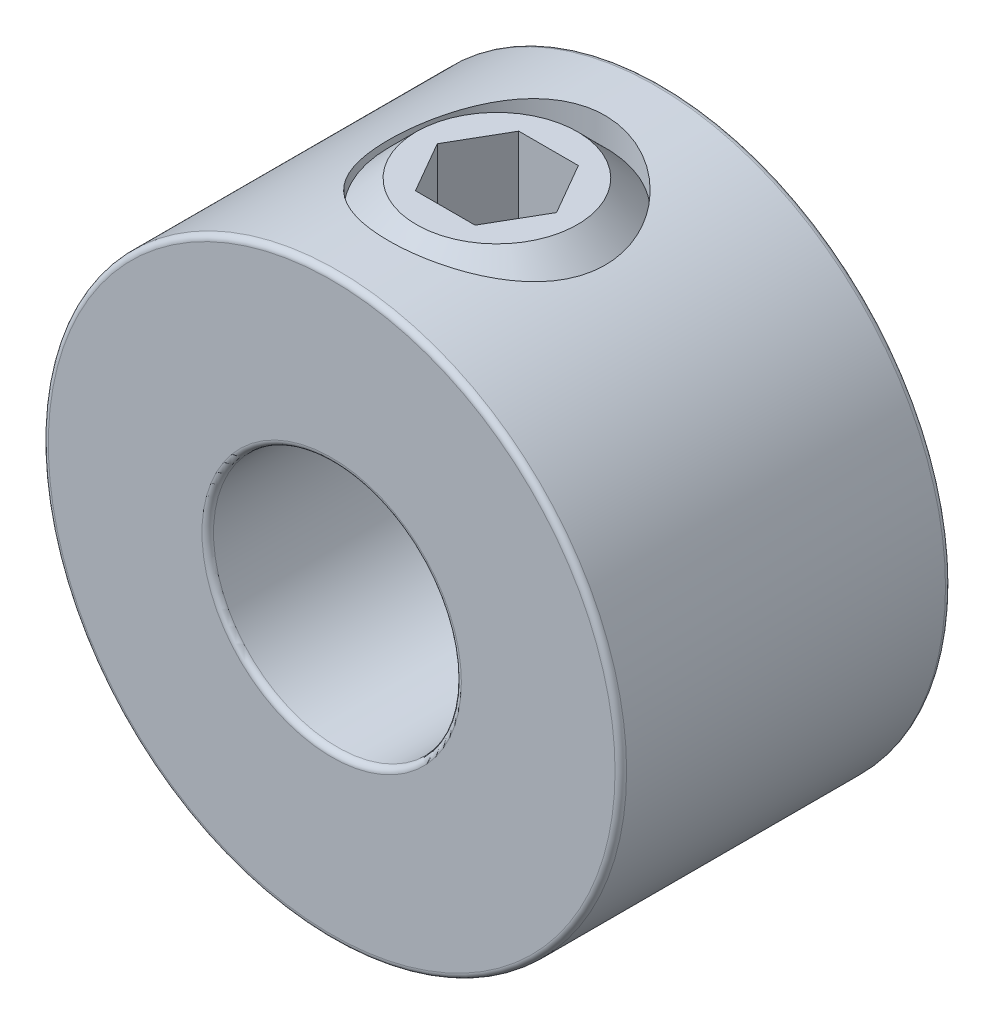
ISO-10303-21;
HEADER;
FILE_DESCRIPTION(('STEP AP214'),'2;1');
FILE_NAME('part.step','',(''),(''),'','','');
FILE_SCHEMA(('AUTOMOTIVE_DESIGN { 1 0 10303 214 1 1 1 1 }'));
ENDSEC;
DATA;
#1=APPLICATION_CONTEXT('core data for automotive mechanical design processes');
#2=APPLICATION_PROTOCOL_DEFINITION('international standard','automotive_design',2000,#1);
#3=PRODUCT_CONTEXT('',#1,'mechanical');
#4=PRODUCT('Part','Part','',(#3));
#5=PRODUCT_RELATED_PRODUCT_CATEGORY('part','',(#4));
#6=PRODUCT_DEFINITION_FORMATION('','',#4);
#7=PRODUCT_DEFINITION_CONTEXT('part definition',#1,'design');
#8=PRODUCT_DEFINITION('design','',#6,#7);
#9=PRODUCT_DEFINITION_SHAPE('','',#8);
#10=(LENGTH_UNIT() NAMED_UNIT(*) SI_UNIT(.MILLI.,.METRE.));
#11=(NAMED_UNIT(*) PLANE_ANGLE_UNIT() SI_UNIT($,.RADIAN.));
#12=(NAMED_UNIT(*) SI_UNIT($,.STERADIAN.) SOLID_ANGLE_UNIT());
#13=UNCERTAINTY_MEASURE_WITH_UNIT(LENGTH_MEASURE(1.E-05),#10,'distance_accuracy_value','');
#14=(GEOMETRIC_REPRESENTATION_CONTEXT(3) GLOBAL_UNCERTAINTY_ASSIGNED_CONTEXT((#13)) GLOBAL_UNIT_ASSIGNED_CONTEXT((#10,
#11,#12)) REPRESENTATION_CONTEXT('',''));
#15=CARTESIAN_POINT('',(0.,0.,0.));
#16=DIRECTION('',(0.,0.,1.));
#17=DIRECTION('',(1.,0.,0.));
#18=AXIS2_PLACEMENT_3D('',#15,#16,#17);
#19=CARTESIAN_POINT('',(0.,5.55625,0.));
#20=DIRECTION('',(0.,1.,0.));
#21=DIRECTION('',(-1.,0.,0.));
#22=AXIS2_PLACEMENT_3D('',#19,#20,#21);
#23=PLANE('',#22);
#24=CARTESIAN_POINT('',(0.,5.55625,0.));
#25=DIRECTION('',(0.,1.,0.));
#26=DIRECTION('',(-1.,0.,0.));
#27=AXIS2_PLACEMENT_3D('',#24,#25,#26);
#28=CIRCLE('',#27,1.54730253738467);
#29=CARTESIAN_POINT('',(-1.54730253738467,5.55625,0.));
#30=VERTEX_POINT('',#29);
#31=EDGE_CURVE('E116',#30,#30,#28,.T.);
#32=ORIENTED_EDGE('',*,*,#31,.T.);
#33=EDGE_LOOP('',(#32));
#34=FACE_BOUND('',#33,.T.);
#35=DIRECTION('',(1.,0.,0.));
#36=VECTOR('',#35,1.);
#37=CARTESIAN_POINT('',(-0.572839720211581,5.55624999999999,-0.992187499999997));
#38=LINE('',#37,#36);
#39=CARTESIAN_POINT('',(-0.572839720211581,5.55624999999999,-0.992187499999997));
#40=VERTEX_POINT('',#39);
#41=CARTESIAN_POINT('',(0.572839720211583,5.55625,-0.992187499999997));
#42=VERTEX_POINT('',#41);
#43=EDGE_CURVE('E111',#40,#42,#38,.T.);
#44=ORIENTED_EDGE('',*,*,#43,.T.);
#45=DIRECTION('',(0.5,0.,0.866025403784439));
#46=VECTOR('',#45,1.);
#47=CARTESIAN_POINT('',(0.572839720211583,5.55624999999999,-0.992187499999997));
#48=LINE('',#47,#46);
#49=CARTESIAN_POINT('',(1.14567944042317,5.55624999999999,0.));
#50=VERTEX_POINT('',#49);
#51=EDGE_CURVE('E57',#42,#50,#48,.T.);
#52=ORIENTED_EDGE('',*,*,#51,.T.);
#53=DIRECTION('',(-0.499999999999999,0.,0.866025403784439));
#54=VECTOR('',#53,1.);
#55=CARTESIAN_POINT('',(1.14567944042317,5.55624999999999,0.));
#56=LINE('',#55,#54);
#57=CARTESIAN_POINT('',(0.572839720211584,5.55624999999999,0.992187500000003));
#58=VERTEX_POINT('',#57);
#59=EDGE_CURVE('E115',#50,#58,#56,.T.);
#60=ORIENTED_EDGE('',*,*,#59,.T.);
#61=DIRECTION('',(-1.,0.,0.));
#62=VECTOR('',#61,1.);
#63=CARTESIAN_POINT('',(0.572839720211584,5.55624999999999,0.992187500000003));
#64=LINE('',#63,#62);
#65=CARTESIAN_POINT('',(-0.572839720211581,5.55624999999999,0.992187500000003));
#66=VERTEX_POINT('',#65);
#67=EDGE_CURVE('E273',#58,#66,#64,.T.);
#68=ORIENTED_EDGE('',*,*,#67,.T.);
#69=DIRECTION('',(-0.5,0.,-0.866025403784439));
#70=VECTOR('',#69,1.);
#71=CARTESIAN_POINT('',(-0.572839720211581,5.55624999999999,0.992187500000003));
#72=LINE('',#71,#70);
#73=CARTESIAN_POINT('',(-1.14567944042316,5.55624999999999,0.));
#74=VERTEX_POINT('',#73);
#75=EDGE_CURVE('E270',#66,#74,#72,.T.);
#76=ORIENTED_EDGE('',*,*,#75,.T.);
#77=DIRECTION('',(0.5,0.,-0.866025403784439));
#78=VECTOR('',#77,1.);
#79=CARTESIAN_POINT('',(-1.14567944042316,5.55624999999999,0.));
#80=LINE('',#79,#78);
#81=EDGE_CURVE('E264',#74,#40,#80,.T.);
#82=ORIENTED_EDGE('',*,*,#81,.T.);
#83=EDGE_LOOP('',(#44,#52,#60,#68,#76,#82));
#84=FACE_BOUND('',#83,.T.);
#85=ADVANCED_FACE('F42',(#34,#84),#23,.T.);
#86=CARTESIAN_POINT('',(0.,2.38125,0.));
#87=DIRECTION('',(0.,-1.,0.));
#88=DIRECTION('',(1.,0.,0.));
#89=AXIS2_PLACEMENT_3D('',#86,#87,#88);
#90=CONICAL_SURFACE('',#89,0.642596955138401,0.785398163397449);
#91=CARTESIAN_POINT('',(0.,3.0238469551384,0.));
#92=VERTEX_POINT('',#91);
#93=VERTEX_LOOP('',#92);
#94=FACE_BOUND('',#93,.T.);
#95=CARTESIAN_POINT('',(0.,2.38125,0.));
#96=DIRECTION('',(0.,1.,0.));
#97=DIRECTION('',(-1.,0.,0.));
#98=AXIS2_PLACEMENT_3D('',#95,#96,#97);
#99=CIRCLE('',#98,0.642596955138401);
#100=CARTESIAN_POINT('',(-0.642596955138401,2.38125,0.));
#101=VERTEX_POINT('',#100);
#102=EDGE_CURVE('E12',#101,#101,#99,.T.);
#103=ORIENTED_EDGE('',*,*,#102,.F.);
#104=EDGE_LOOP('',(#103));
#105=FACE_BOUND('',#104,.T.);
#106=ADVANCED_FACE('F44',(#94,#105),#90,.F.);
#107=CARTESIAN_POINT('',(-1.54730253738467,2.38125,0.));
#108=DIRECTION('',(0.,-1.,0.));
#109=DIRECTION('',(1.,0.,0.));
#110=AXIS2_PLACEMENT_3D('',#107,#108,#109);
#111=PLANE('',#110);
#112=ORIENTED_EDGE('',*,*,#102,.T.);
#113=EDGE_LOOP('',(#112));
#114=FACE_BOUND('',#113,.T.);
#115=CARTESIAN_POINT('',(0.,2.38125,0.));
#116=DIRECTION('',(0.,1.,0.));
#117=DIRECTION('',(-1.,0.,0.));
#118=AXIS2_PLACEMENT_3D('',#115,#116,#117);
#119=CIRCLE('',#118,1.54730253738467);
#120=CARTESIAN_POINT('',(-1.54730253738467,2.38125,0.));
#121=VERTEX_POINT('',#120);
#122=EDGE_CURVE('E50',#121,#121,#119,.T.);
#123=ORIENTED_EDGE('',*,*,#122,.F.);
#124=EDGE_LOOP('',(#123));
#125=FACE_BOUND('',#124,.T.);
#126=ADVANCED_FACE('F136',(#114,#125),#111,.T.);
#127=CARTESIAN_POINT('',(0.,2.91674746261533,0.));
#128=DIRECTION('',(0.,1.,0.));
#129=DIRECTION('',(-1.,0.,0.));
#130=AXIS2_PLACEMENT_3D('',#127,#128,#129);
#131=CONICAL_SURFACE('',#130,2.0828,0.785398163397448);
#132=ORIENTED_EDGE('',*,*,#122,.T.);
#133=EDGE_LOOP('',(#132));
#134=FACE_BOUND('',#133,.T.);
#135=CARTESIAN_POINT('',(0.,2.91674746261533,0.));
#136=DIRECTION('',(0.,1.,0.));
#137=DIRECTION('',(-1.,0.,0.));
#138=AXIS2_PLACEMENT_3D('',#135,#136,#137);
#139=CIRCLE('',#138,2.0828);
#140=CARTESIAN_POINT('',(-2.0828,2.91674746261533,0.));
#141=VERTEX_POINT('',#140);
#142=EDGE_CURVE('E128',#141,#141,#139,.T.);
#143=ORIENTED_EDGE('',*,*,#142,.F.);
#144=EDGE_LOOP('',(#143));
#145=FACE_BOUND('',#144,.T.);
#146=ADVANCED_FACE('F133',(#134,#145),#131,.T.);
#147=CARTESIAN_POINT('',(0.,2.38125,0.));
#148=DIRECTION('',(0.,1.,0.));
#149=DIRECTION('',(-1.,0.,0.));
#150=AXIS2_PLACEMENT_3D('',#147,#148,#149);
#151=CYLINDRICAL_SURFACE('',#150,2.0828);
#152=ORIENTED_EDGE('',*,*,#142,.T.);
#153=EDGE_LOOP('',(#152));
#154=FACE_BOUND('',#153,.T.);
#155=CARTESIAN_POINT('',(0.,5.02075253738467,0.));
#156=DIRECTION('',(0.,1.,0.));
#157=DIRECTION('',(-1.,0.,0.));
#158=AXIS2_PLACEMENT_3D('',#155,#156,#157);
#159=CIRCLE('',#158,2.0828);
#160=CARTESIAN_POINT('',(-2.0828,5.02075253738467,0.));
#161=VERTEX_POINT('',#160);
#162=EDGE_CURVE('E120',#161,#161,#159,.T.);
#163=ORIENTED_EDGE('',*,*,#162,.F.);
#164=EDGE_LOOP('',(#163));
#165=FACE_BOUND('',#164,.T.);
#166=ADVANCED_FACE('F143',(#154,#165),#151,.T.);
#167=CARTESIAN_POINT('',(0.,5.55625,0.));
#168=DIRECTION('',(0.,-1.,0.));
#169=DIRECTION('',(1.,0.,0.));
#170=AXIS2_PLACEMENT_3D('',#167,#168,#169);
#171=CONICAL_SURFACE('',#170,1.54730253738467,0.785398163397448);
#172=ORIENTED_EDGE('',*,*,#162,.T.);
#173=EDGE_LOOP('',(#172));
#174=FACE_BOUND('',#173,.T.);
#175=ORIENTED_EDGE('',*,*,#31,.F.);
#176=EDGE_LOOP('',(#175));
#177=FACE_BOUND('',#176,.T.);
#178=ADVANCED_FACE('F154',(#174,#177),#171,.T.);
#179=CARTESIAN_POINT('',(0.572839720211583,3.57187499999999,-0.992187499999997));
#180=DIRECTION('',(-0.866025403784439,0.,0.5));
#181=DIRECTION('',(0.5,0.,0.866025403784439));
#182=AXIS2_PLACEMENT_3D('',#179,#180,#181);
#183=PLANE('',#182);
#184=ORIENTED_EDGE('',*,*,#51,.F.);
#185=DIRECTION('',(0.,1.,0.));
#186=VECTOR('',#185,1.);
#187=CARTESIAN_POINT('',(0.572839720211583,3.57187499999999,-0.992187499999997));
#188=LINE('',#187,#186);
#189=CARTESIAN_POINT('',(0.572839720211583,3.57187499999999,-0.992187499999997));
#190=VERTEX_POINT('',#189);
#191=EDGE_CURVE('E110',#190,#42,#188,.T.);
#192=ORIENTED_EDGE('',*,*,#191,.F.);
#193=DIRECTION('',(0.5,0.,0.866025403784439));
#194=VECTOR('',#193,1.);
#195=CARTESIAN_POINT('',(0.572839720211583,3.57187499999999,-0.992187499999997));
#196=LINE('',#195,#194);
#197=CARTESIAN_POINT('',(1.14567944042317,3.57187499999999,0.));
#198=VERTEX_POINT('',#197);
#199=EDGE_CURVE('E101',#190,#198,#196,.T.);
#200=ORIENTED_EDGE('',*,*,#199,.T.);
#201=DIRECTION('',(0.,1.,0.));
#202=VECTOR('',#201,1.);
#203=CARTESIAN_POINT('',(1.14567944042317,3.57187499999999,0.));
#204=LINE('',#203,#202);
#205=EDGE_CURVE('E109',#198,#50,#204,.T.);
#206=ORIENTED_EDGE('',*,*,#205,.T.);
#207=EDGE_LOOP('',(#184,#192,#200,#206));
#208=FACE_BOUND('',#207,.T.);
#209=ADVANCED_FACE('F108',(#208),#183,.T.);
#210=CARTESIAN_POINT('',(1.14567944042317,3.57187499999999,0.));
#211=DIRECTION('',(-0.866025403784439,0.,-0.499999999999999));
#212=DIRECTION('',(-0.499999999999999,0.,0.866025403784439));
#213=AXIS2_PLACEMENT_3D('',#210,#211,#212);
#214=PLANE('',#213);
#215=ORIENTED_EDGE('',*,*,#59,.F.);
#216=ORIENTED_EDGE('',*,*,#205,.F.);
#217=DIRECTION('',(-0.499999999999999,0.,0.866025403784439));
#218=VECTOR('',#217,1.);
#219=CARTESIAN_POINT('',(1.14567944042317,3.57187499999999,0.));
#220=LINE('',#219,#218);
#221=CARTESIAN_POINT('',(0.572839720211584,3.57187499999999,0.992187500000003));
#222=VERTEX_POINT('',#221);
#223=EDGE_CURVE('E97',#198,#222,#220,.T.);
#224=ORIENTED_EDGE('',*,*,#223,.T.);
#225=DIRECTION('',(0.,1.,0.));
#226=VECTOR('',#225,1.);
#227=CARTESIAN_POINT('',(0.572839720211584,3.57187499999999,0.992187500000003));
#228=LINE('',#227,#226);
#229=EDGE_CURVE('E117',#222,#58,#228,.T.);
#230=ORIENTED_EDGE('',*,*,#229,.T.);
#231=EDGE_LOOP('',(#215,#216,#224,#230));
#232=FACE_BOUND('',#231,.T.);
#233=ADVANCED_FACE('F113',(#232),#214,.T.);
#234=CARTESIAN_POINT('',(0.572839720211584,3.57187499999999,0.992187500000003));
#235=DIRECTION('',(0.,0.,-1.));
#236=DIRECTION('',(-1.,0.,0.));
#237=AXIS2_PLACEMENT_3D('',#234,#235,#236);
#238=PLANE('',#237);
#239=ORIENTED_EDGE('',*,*,#67,.F.);
#240=ORIENTED_EDGE('',*,*,#229,.F.);
#241=DIRECTION('',(-1.,0.,0.));
#242=VECTOR('',#241,1.);
#243=CARTESIAN_POINT('',(0.572839720211584,3.57187499999999,0.992187500000003));
#244=LINE('',#243,#242);
#245=CARTESIAN_POINT('',(-0.572839720211581,3.57187499999999,0.992187500000003));
#246=VERTEX_POINT('',#245);
#247=EDGE_CURVE('E103',#222,#246,#244,.T.);
#248=ORIENTED_EDGE('',*,*,#247,.T.);
#249=DIRECTION('',(0.,1.,0.));
#250=VECTOR('',#249,1.);
#251=CARTESIAN_POINT('',(-0.572839720211581,3.57187499999999,0.992187500000003));
#252=LINE('',#251,#250);
#253=EDGE_CURVE('E122',#246,#66,#252,.T.);
#254=ORIENTED_EDGE('',*,*,#253,.T.);
#255=EDGE_LOOP('',(#239,#240,#248,#254));
#256=FACE_BOUND('',#255,.T.);
#257=ADVANCED_FACE('F184',(#256),#238,.T.);
#258=CARTESIAN_POINT('',(-0.572839720211581,3.57187499999999,0.992187500000003));
#259=DIRECTION('',(0.866025403784439,0.,-0.5));
#260=DIRECTION('',(-0.5,0.,-0.866025403784439));
#261=AXIS2_PLACEMENT_3D('',#258,#259,#260);
#262=PLANE('',#261);
#263=ORIENTED_EDGE('',*,*,#75,.F.);
#264=ORIENTED_EDGE('',*,*,#253,.F.);
#265=DIRECTION('',(-0.5,0.,-0.866025403784439));
#266=VECTOR('',#265,1.);
#267=CARTESIAN_POINT('',(-0.572839720211581,3.57187499999999,0.992187500000003));
#268=LINE('',#267,#266);
#269=CARTESIAN_POINT('',(-1.14567944042316,3.57187499999999,0.));
#270=VERTEX_POINT('',#269);
#271=EDGE_CURVE('E289',#246,#270,#268,.T.);
#272=ORIENTED_EDGE('',*,*,#271,.T.);
#273=DIRECTION('',(0.,1.,0.));
#274=VECTOR('',#273,1.);
#275=CARTESIAN_POINT('',(-1.14567944042316,3.57187499999999,0.));
#276=LINE('',#275,#274);
#277=EDGE_CURVE('E280',#270,#74,#276,.T.);
#278=ORIENTED_EDGE('',*,*,#277,.T.);
#279=EDGE_LOOP('',(#263,#264,#272,#278));
#280=FACE_BOUND('',#279,.T.);
#281=ADVANCED_FACE('F190',(#280),#262,.T.);
#282=CARTESIAN_POINT('',(-1.14567944042316,3.57187499999999,0.));
#283=DIRECTION('',(0.866025403784439,0.,0.5));
#284=DIRECTION('',(0.5,0.,-0.866025403784439));
#285=AXIS2_PLACEMENT_3D('',#282,#283,#284);
#286=PLANE('',#285);
#287=ORIENTED_EDGE('',*,*,#81,.F.);
#288=ORIENTED_EDGE('',*,*,#277,.F.);
#289=DIRECTION('',(0.5,0.,-0.866025403784439));
#290=VECTOR('',#289,1.);
#291=CARTESIAN_POINT('',(-1.14567944042316,3.57187499999999,0.));
#292=LINE('',#291,#290);
#293=CARTESIAN_POINT('',(-0.572839720211581,3.57187499999999,-0.992187499999997));
#294=VERTEX_POINT('',#293);
#295=EDGE_CURVE('E287',#270,#294,#292,.T.);
#296=ORIENTED_EDGE('',*,*,#295,.T.);
#297=DIRECTION('',(0.,1.,0.));
#298=VECTOR('',#297,1.);
#299=CARTESIAN_POINT('',(-0.572839720211581,3.57187499999999,-0.992187499999997));
#300=LINE('',#299,#298);
#301=EDGE_CURVE('E263',#294,#40,#300,.T.);
#302=ORIENTED_EDGE('',*,*,#301,.T.);
#303=EDGE_LOOP('',(#287,#288,#296,#302));
#304=FACE_BOUND('',#303,.T.);
#305=ADVANCED_FACE('F198',(#304),#286,.T.);
#306=CARTESIAN_POINT('',(-0.572839720211581,3.57187499999999,-0.992187499999997));
#307=DIRECTION('',(0.,0.,1.));
#308=DIRECTION('',(1.,0.,0.));
#309=AXIS2_PLACEMENT_3D('',#306,#307,#308);
#310=PLANE('',#309);
#311=ORIENTED_EDGE('',*,*,#43,.F.);
#312=ORIENTED_EDGE('',*,*,#301,.F.);
#313=DIRECTION('',(1.,0.,0.));
#314=VECTOR('',#313,1.);
#315=CARTESIAN_POINT('',(-0.572839720211581,3.57187499999999,-0.992187499999997));
#316=LINE('',#315,#314);
#317=EDGE_CURVE('E278',#294,#190,#316,.T.);
#318=ORIENTED_EDGE('',*,*,#317,.T.);
#319=ORIENTED_EDGE('',*,*,#191,.T.);
#320=EDGE_LOOP('',(#311,#312,#318,#319));
#321=FACE_BOUND('',#320,.T.);
#322=ADVANCED_FACE('F206',(#321),#310,.T.);
#323=CARTESIAN_POINT('',(0.,3.57187499999999,-1.984375));
#324=DIRECTION('',(0.,1.,0.));
#325=DIRECTION('',(0.,0.,1.));
#326=AXIS2_PLACEMENT_3D('',#323,#324,#325);
#327=PLANE('',#326);
#328=ORIENTED_EDGE('',*,*,#199,.F.);
#329=ORIENTED_EDGE('',*,*,#317,.F.);
#330=ORIENTED_EDGE('',*,*,#295,.F.);
#331=ORIENTED_EDGE('',*,*,#271,.F.);
#332=ORIENTED_EDGE('',*,*,#247,.F.);
#333=ORIENTED_EDGE('',*,*,#223,.F.);
#334=EDGE_LOOP('',(#328,#329,#330,#331,#332,#333));
#335=FACE_BOUND('',#334,.T.);
#336=ADVANCED_FACE('F99',(#335),#327,.T.);
#337=CLOSED_SHELL('',(#85,#106,#126,#146,#166,#178,#209,#233,#257,#281,#305,#322,#336));
#338=MANIFOLD_SOLID_BREP('B2',#337);
#339=CARTESIAN_POINT('',(0.,0.,3.175));
#340=DIRECTION('',(0.,0.,1.));
#341=DIRECTION('',(1.,0.,0.));
#342=AXIS2_PLACEMENT_3D('',#339,#340,#341);
#343=PLANE('',#342);
#344=CARTESIAN_POINT('',(0.,0.,3.175));
#345=DIRECTION('',(0.,0.,1.));
#346=DIRECTION('',(1.,0.,0.));
#347=AXIS2_PLACEMENT_3D('',#344,#345,#346);
#348=CIRCLE('',#347,2.492375);
#349=CARTESIAN_POINT('',(2.492375,0.,3.175));
#350=VERTEX_POINT('',#349);
#351=EDGE_CURVE('E307',#350,#350,#348,.F.);
#352=ORIENTED_EDGE('',*,*,#351,.T.);
#353=EDGE_LOOP('',(#352));
#354=FACE_BOUND('',#353,.T.);
#355=CARTESIAN_POINT('',(0.,0.,3.175));
#356=DIRECTION('',(0.,0.,1.));
#357=DIRECTION('',(1.,0.,0.));
#358=AXIS2_PLACEMENT_3D('',#355,#356,#357);
#359=CIRCLE('',#358,5.445125);
#360=CARTESIAN_POINT('',(5.445125,0.,3.175));
#361=VERTEX_POINT('',#360);
#362=EDGE_CURVE('E311',#361,#361,#359,.T.);
#363=ORIENTED_EDGE('',*,*,#362,.T.);
#364=EDGE_LOOP('',(#363));
#365=FACE_BOUND('',#364,.T.);
#366=ADVANCED_FACE('F296',(#354,#365),#343,.T.);
#367=CARTESIAN_POINT('',(0.,0.,-3.175));
#368=DIRECTION('',(0.,0.,1.));
#369=DIRECTION('',(1.,0.,0.));
#370=AXIS2_PLACEMENT_3D('',#367,#368,#369);
#371=PLANE('',#370);
#372=CARTESIAN_POINT('',(0.,0.,-3.175));
#373=DIRECTION('',(0.,0.,1.));
#374=DIRECTION('',(1.,0.,0.));
#375=AXIS2_PLACEMENT_3D('',#372,#373,#374);
#376=CIRCLE('',#375,2.492375);
#377=CARTESIAN_POINT('',(2.492375,0.,-3.175));
#378=VERTEX_POINT('',#377);
#379=EDGE_CURVE('E322',#378,#378,#376,.T.);
#380=ORIENTED_EDGE('',*,*,#379,.T.);
#381=EDGE_LOOP('',(#380));
#382=FACE_BOUND('',#381,.T.);
#383=CARTESIAN_POINT('',(0.,0.,-3.175));
#384=DIRECTION('',(0.,0.,1.));
#385=DIRECTION('',(1.,0.,0.));
#386=AXIS2_PLACEMENT_3D('',#383,#384,#385);
#387=CIRCLE('',#386,5.445125);
#388=CARTESIAN_POINT('',(5.445125,0.,-3.175));
#389=VERTEX_POINT('',#388);
#390=EDGE_CURVE('E325',#389,#389,#387,.F.);
#391=ORIENTED_EDGE('',*,*,#390,.T.);
#392=EDGE_LOOP('',(#391));
#393=FACE_BOUND('',#392,.T.);
#394=ADVANCED_FACE('F361',(#382,#393),#371,.F.);
#395=CARTESIAN_POINT('',(0.,0.,3.175));
#396=DIRECTION('',(0.,0.,-1.));
#397=DIRECTION('',(-1.,0.,0.));
#398=AXIS2_PLACEMENT_3D('',#395,#396,#397);
#399=CYLINDRICAL_SURFACE('',#398,5.55625);
#400=CARTESIAN_POINT('',(0.,0.,-3.063875));
#401=DIRECTION('',(0.,0.,1.));
#402=DIRECTION('',(1.,0.,0.));
#403=AXIS2_PLACEMENT_3D('',#400,#401,#402);
#404=CIRCLE('',#403,5.55625);
#405=CARTESIAN_POINT('',(5.55625,0.,-3.063875));
#406=VERTEX_POINT('',#405);
#407=EDGE_CURVE('E41',#406,#406,#404,.T.);
#408=ORIENTED_EDGE('',*,*,#407,.T.);
#409=EDGE_LOOP('',(#408));
#410=FACE_BOUND('',#409,.T.);
#411=CARTESIAN_POINT('',(0.,0.,3.063875));
#412=DIRECTION('',(0.,0.,1.));
#413=DIRECTION('',(1.,0.,0.));
#414=AXIS2_PLACEMENT_3D('',#411,#412,#413);
#415=CIRCLE('',#414,5.55625);
#416=CARTESIAN_POINT('',(5.55625,0.,3.063875));
#417=VERTEX_POINT('',#416);
#418=EDGE_CURVE('E303',#417,#417,#415,.F.);
#419=ORIENTED_EDGE('',*,*,#418,.T.);
#420=EDGE_LOOP('',(#419));
#421=FACE_BOUND('',#420,.T.);
#422=CARTESIAN_POINT('',(0.,5.55625,-2.0828));
#423=CARTESIAN_POINT('',(0.112800632930004,5.55625300768121,-2.08280401535049));
#424=CARTESIAN_POINT('',(0.22557375650504,5.55278505962081,-2.07360774080138));
#425=CARTESIAN_POINT('',(0.447749891057454,5.5392973200522,-2.03721439435715));
#426=CARTESIAN_POINT('',(0.55715338230433,5.5292784668036,-2.0100199002673));
#427=CARTESIAN_POINT('',(0.7693540019046,5.50376437690656,-1.93872693071781));
#428=CARTESIAN_POINT('',(0.872163424064122,5.48827970334317,-1.89466104660532));
#429=CARTESIAN_POINT('',(1.06892323856479,5.4533764248173,-1.79104186225435));
#430=CARTESIAN_POINT('',(1.16287124747356,5.43395676586827,-1.73148441138188));
#431=CARTESIAN_POINT('',(1.34322911463978,5.39226740506348,-1.59593235187956));
#432=CARTESIAN_POINT('',(1.42921302733438,5.36991708646606,-1.51939602956842));
#433=CARTESIAN_POINT('',(1.58746804313499,5.3252823776817,-1.35320883055734));
#434=CARTESIAN_POINT('',(1.65973495359077,5.30299800969504,-1.26355395890717));
#435=CARTESIAN_POINT('',(1.79121226481723,5.26008047465291,-1.06951383102155));
#436=CARTESIAN_POINT('',(1.84982111942716,5.23954242039672,-0.964697836024094));
#437=CARTESIAN_POINT('',(1.94838923392661,5.20369722833776,-0.745805447537557));
#438=CARTESIAN_POINT('',(1.98835593632194,5.18838800368424,-0.631732770982777));
#439=CARTESIAN_POINT('',(2.04682402169344,5.16559576084147,-0.402467790242334));
#440=CARTESIAN_POINT('',(2.06613822134155,5.15781763095547,-0.287513102391948));
#441=CARTESIAN_POINT('',(2.08529440426013,5.15010472983807,-0.0557514095444379));
#442=CARTESIAN_POINT('',(2.08514442146683,5.15016672255756,0.0610548113178707));
#443=CARTESIAN_POINT('',(2.06599808773832,5.15787259600182,0.285767992124775));
#444=CARTESIAN_POINT('',(2.04812917392808,5.16506290320801,0.393789454265148));
#445=CARTESIAN_POINT('',(1.99591596349076,5.18546148958707,0.605171149502855));
#446=CARTESIAN_POINT('',(1.96156918768862,5.19867067431454,0.708530678628621));
#447=CARTESIAN_POINT('',(1.87675563584502,5.2298919804838,0.909953267713995));
#448=CARTESIAN_POINT('',(1.82599630573539,5.24799020400401,1.00787920704196));
#449=CARTESIAN_POINT('',(1.71000247451572,5.28692170218376,1.19415076370434));
#450=CARTESIAN_POINT('',(1.64476297834093,5.3077559196341,1.28249305937992));
#451=CARTESIAN_POINT('',(1.4965021407131,5.35151860221495,1.45333045485081));
#452=CARTESIAN_POINT('',(1.41258090144428,5.37449375049466,1.53503453035891));
#453=CARTESIAN_POINT('',(1.23196365426747,5.41874674251992,1.68344452863914));
#454=CARTESIAN_POINT('',(1.1352656895903,5.44002432547937,1.75014814983905));
#455=CARTESIAN_POINT('',(0.929823331313823,5.47890719997606,1.86753532666365));
#456=CARTESIAN_POINT('',(0.820915981682845,5.49645071347302,1.91795560812022));
#457=CARTESIAN_POINT('',(0.595343579335006,5.52543048412729,1.99949665444985));
#458=CARTESIAN_POINT('',(0.478681994972036,5.53686945135909,2.03062598440935));
#459=CARTESIAN_POINT('',(0.247570187168623,5.5518749936626,2.07118115087403));
#460=CARTESIAN_POINT('',(0.133331773827584,5.55582753103965,2.08167220007853));
#461=CARTESIAN_POINT('',(-0.0953283436577317,5.55660748535906,2.083754441011));
#462=CARTESIAN_POINT('',(-0.209750001589684,5.55343648058412,2.07534981923885));
#463=CARTESIAN_POINT('',(-0.430926540416132,5.54058024960133,2.04068898213469));
#464=CARTESIAN_POINT('',(-0.537807116159227,5.53114977163135,2.01513045938022));
#465=CARTESIAN_POINT('',(-0.745687864829837,5.50697945787875,1.94780582513564));
#466=CARTESIAN_POINT('',(-0.846687270958335,5.49223893155362,1.90603760560919));
#467=CARTESIAN_POINT('',(-1.04326337793135,5.45836614698944,1.80614776949349));
#468=CARTESIAN_POINT('',(-1.13859364241543,5.43911760327552,1.74758182189689));
#469=CARTESIAN_POINT('',(-1.31839271067494,5.39835785558102,1.61626143061731));
#470=CARTESIAN_POINT('',(-1.40285748760972,5.37684581806946,1.54350175161408));
#471=CARTESIAN_POINT('',(-1.5636497571678,5.33237981787699,1.3808954905382));
#472=CARTESIAN_POINT('',(-1.63922162799222,5.30941456183645,1.2903028632398));
#473=CARTESIAN_POINT('',(-1.77423955261877,5.26583668916757,1.09727040858404));
#474=CARTESIAN_POINT('',(-1.83368416430154,5.24522428302937,0.994829522908312));
#475=CARTESIAN_POINT('',(-1.93481923474378,5.2087720132518,0.780165029958659));
#476=CARTESIAN_POINT('',(-1.97643552425905,5.19295216591895,0.667902850327276));
#477=CARTESIAN_POINT('',(-2.03990093033916,5.16835555583759,0.437205681476789));
#478=CARTESIAN_POINT('',(-2.06176226343082,5.15957444069517,0.318774555150432));
#479=CARTESIAN_POINT('',(-2.08400604935767,5.15062742767764,0.0872883285335795));
#480=CARTESIAN_POINT('',(-2.08567688417979,5.14994480894648,-0.0256240229937523));
#481=CARTESIAN_POINT('',(-2.07079252565419,5.15594759760087,-0.250030481291804));
#482=CARTESIAN_POINT('',(-2.05423905778867,5.16263230744571,-0.361524721318785));
#483=CARTESIAN_POINT('',(-2.0043787434665,5.1821866620233,-0.576481637548906));
#484=CARTESIAN_POINT('',(-1.97159779594338,5.19486162518906,-0.68008552574187));
#485=CARTESIAN_POINT('',(-1.89067616429862,5.22485507472632,-0.880383384458793));
#486=CARTESIAN_POINT('',(-1.84253159866192,5.24217473437253,-0.97707560123107));
#487=CARTESIAN_POINT('',(-1.72932228141872,5.28063498027688,-1.16631306072801));
#488=CARTESIAN_POINT('',(-1.6635032144585,5.30192820905341,-1.25837563942295));
#489=CARTESIAN_POINT('',(-1.51798138023012,5.34541005082352,-1.43056079319698));
#490=CARTESIAN_POINT('',(-1.43827420211132,5.36759894655465,-1.51067955988693));
#491=CARTESIAN_POINT('',(-1.26208849099773,5.41181284852435,-1.66111819025951));
#492=CARTESIAN_POINT('',(-1.16493627252017,5.43376415796984,-1.73067424974454));
#493=CARTESIAN_POINT('',(-0.959551270436361,5.47376576077515,-1.85244953260773));
#494=CARTESIAN_POINT('',(-0.851317639554694,5.491815755515,-1.90466742902754));
#495=CARTESIAN_POINT('',(-0.62186338385069,5.5226027657999,-1.99173944958096));
#496=CARTESIAN_POINT('',(-0.500284487091534,5.53507803240463,-2.02575064676068));
#497=CARTESIAN_POINT('',(-0.252457334192373,5.55189793213197,-2.07127304477625));
#498=CARTESIAN_POINT('',(-0.126211447425829,5.55624663473698,-2.08279550726637));
#499=CARTESIAN_POINT('',(0.,5.55625,-2.0828));
#500=B_SPLINE_CURVE_WITH_KNOTS('',3,(#422,#423,#424,#425,#426,#427,#428,#429,#430,#431,#432,
#433,#434,#435,#436,#437,#438,#439,#440,#441,#442,#443,#444,#445,#446,#447,#448,#449,#450,#451,
#452,#453,#454,#455,#456,#457,#458,#459,#460,#461,#462,#463,#464,#465,#466,#467,#468,#469,#470,
#471,#472,#473,#474,#475,#476,#477,#478,#479,#480,#481,#482,#483,#484,#485,#486,#487,#488,#489,
#490,#491,#492,#493,#494,#495,#496,#497,#498,#499),.UNSPECIFIED.,.T.,.F.,(4,2,2,2,2,2,2,2,2,2,2,
2,2,2,2,2,2,2,2,2,2,2,2,2,2,2,2,2,2,2,2,2,2,2,2,2,2,2,4),(0.,0.337936375735737,
0.675824360812358,1.01306289665027,1.35039188157959,1.70062735361547,2.05096970458192,
2.41464480516559,2.77817459121935,3.12680120299707,3.47528391789854,3.80292943607457,
4.13062426559094,4.46451595605232,4.7985230049902,5.15495935990809,5.51145036684649,
5.87344604132048,6.23528087614685,6.57789186152055,6.92042694593843,7.24981241891747,
7.57924074213389,7.91834581789554,8.25757620897215,8.6164728789594,8.97540163135854,
9.33580942789548,9.6959941942964,10.0330639252718,10.3701017451327,10.6968689808505,
11.023718837565,11.3676926275184,11.7117758630099,12.0744589282967,12.4371697447618,
12.8154727091034,13.1935861825084),.UNSPECIFIED.);
#501=CARTESIAN_POINT('',(0.,5.55625,-2.0828));
#502=VERTEX_POINT('',#501);
#503=EDGE_CURVE('E328',#502,#502,#500,.T.);
#504=ORIENTED_EDGE('',*,*,#503,.T.);
#505=EDGE_LOOP('',(#504));
#506=FACE_BOUND('',#505,.T.);
#507=ADVANCED_FACE('F357',(#410,#421,#506),#399,.T.);
#508=CARTESIAN_POINT('',(0.,0.,3.175));
#509=DIRECTION('',(0.,0.,-1.));
#510=DIRECTION('',(-1.,0.,0.));
#511=AXIS2_PLACEMENT_3D('',#508,#509,#510);
#512=CYLINDRICAL_SURFACE('',#511,2.38125);
#513=CARTESIAN_POINT('',(0.,0.,-3.063875));
#514=DIRECTION('',(0.,0.,1.));
#515=DIRECTION('',(1.,0.,0.));
#516=AXIS2_PLACEMENT_3D('',#513,#514,#515);
#517=CIRCLE('',#516,2.38125);
#518=CARTESIAN_POINT('',(2.38125,0.,-3.063875));
#519=VERTEX_POINT('',#518);
#520=EDGE_CURVE('E316',#519,#519,#517,.F.);
#521=ORIENTED_EDGE('',*,*,#520,.T.);
#522=EDGE_LOOP('',(#521));
#523=FACE_BOUND('',#522,.T.);
#524=CARTESIAN_POINT('',(0.,0.,3.063875));
#525=DIRECTION('',(0.,0.,1.));
#526=DIRECTION('',(1.,0.,0.));
#527=AXIS2_PLACEMENT_3D('',#524,#525,#526);
#528=CIRCLE('',#527,2.38125);
#529=CARTESIAN_POINT('',(2.38125,0.,3.063875));
#530=VERTEX_POINT('',#529);
#531=EDGE_CURVE('E319',#530,#530,#528,.T.);
#532=ORIENTED_EDGE('',*,*,#531,.T.);
#533=EDGE_LOOP('',(#532));
#534=FACE_BOUND('',#533,.T.);
#535=CARTESIAN_POINT('',(0.,2.38125,-2.0828));
#536=CARTESIAN_POINT('',(0.0973929494177684,2.38124169738782,-2.0827915570918));
#537=CARTESIAN_POINT('',(0.194878185940059,2.37521781554013,-2.07591171882672));
#538=CARTESIAN_POINT('',(0.386611258583447,2.35164968767381,-2.04890264000986));
#539=CARTESIAN_POINT('',(0.480853978952414,2.3340880433526,-2.02875338981486));
#540=CARTESIAN_POINT('',(0.662803659347758,2.28905523455364,-1.97677664742931));
#541=CARTESIAN_POINT('',(0.75054877728157,2.2616485703984,-1.94502514538759));
#542=CARTESIAN_POINT('',(0.918571873428455,2.19878218385056,-1.87155180534715));
#543=CARTESIAN_POINT('',(0.99884811071721,2.1633205905272,-1.82982765086731));
#544=CARTESIAN_POINT('',(1.18071922841444,2.07129585780852,-1.72022822579019));
#545=CARTESIAN_POINT('',(1.27853737094912,2.0118781146196,-1.64848208475406));
#546=CARTESIAN_POINT('',(1.45806357215512,1.88586761865119,-1.49209731149189));
#547=CARTESIAN_POINT('',(1.53972806694118,1.81925619295101,-1.40742487863816));
#548=CARTESIAN_POINT('',(1.68869453885767,1.6819858226797,-1.2249729255154));
#549=CARTESIAN_POINT('',(1.75564607190694,1.61127039279956,-1.12694868304153));
#550=CARTESIAN_POINT('',(1.84345429424187,1.50800710053804,-0.97121630008627));
#551=CARTESIAN_POINT('',(1.87060881961605,1.47407256364515,-0.917888521467719));
#552=CARTESIAN_POINT('',(1.92061526818784,1.40829212459068,-0.808044061015269));
#553=CARTESIAN_POINT('',(1.94347046844694,1.37644464378392,-0.751529851023461));
#554=CARTESIAN_POINT('',(1.9852419773873,1.315511128209,-0.63318871451696));
#555=CARTESIAN_POINT('',(2.0040184380061,1.28653757816364,-0.571252869807721));
#556=CARTESIAN_POINT('',(2.03611895045125,1.23510794067766,-0.443396479408751));
#557=CARTESIAN_POINT('',(2.04945357647637,1.21263923840387,-0.377483949924727));
#558=CARTESIAN_POINT('',(2.06824894331714,1.18025423126636,-0.252487067881276));
#559=CARTESIAN_POINT('',(2.07460644232956,1.16893709122594,-0.193915875114199));
#560=CARTESIAN_POINT('',(2.08227591133755,1.1552262688524,-0.0754398336108357));
#561=CARTESIAN_POINT('',(2.08359575166085,1.15281866733807,-0.0155372123750084));
#562=CARTESIAN_POINT('',(2.08106950061304,1.15736954716532,0.10377947309331));
#563=CARTESIAN_POINT('',(2.07722335982678,1.16432811809892,0.163193532646999));
#564=CARTESIAN_POINT('',(2.06473187058198,1.18633414982618,0.280011030793917));
#565=CARTESIAN_POINT('',(2.05607696372146,1.20139771906409,0.337410222062291));
#566=CARTESIAN_POINT('',(2.02802431587873,1.24843208844284,0.483285695571535));
#567=CARTESIAN_POINT('',(2.0052950866678,1.28511818916213,0.569556080939492));
#568=CARTESIAN_POINT('',(1.95069238856916,1.36659247872681,0.735199379665903));
#569=CARTESIAN_POINT('',(1.91878058772755,1.41141433391192,0.814541523232048));
#570=CARTESIAN_POINT('',(1.85374053193307,1.4954086671148,0.951979144551208));
#571=CARTESIAN_POINT('',(1.82209669171924,1.53394908324055,1.01117643344989));
#572=CARTESIAN_POINT('',(1.7535497701739,1.61186697150651,1.12587193974643));
#573=CARTESIAN_POINT('',(1.71664375526402,1.65124490005753,1.18136806830602));
#574=CARTESIAN_POINT('',(1.59813215574374,1.76880002686161,1.34230349146105));
#575=CARTESIAN_POINT('',(1.50860748259122,1.84657107217174,1.44245348058046));
#576=CARTESIAN_POINT('',(1.33111081686616,1.97680164405594,1.60536484894449));
#577=CARTESIAN_POINT('',(1.2474304118645,2.030991477709,1.67144637043296));
#578=CARTESIAN_POINT('',(1.06747624024202,2.13105292684301,1.79170691658156));
#579=CARTESIAN_POINT('',(0.971224582250847,2.17693881588416,1.84590639972253));
#580=CARTESIAN_POINT('',(0.786487670098551,2.2493775064581,1.93074791918545));
#581=CARTESIAN_POINT('',(0.699954147004295,2.27794385536502,1.96390422775058));
#582=CARTESIAN_POINT('',(0.520793119382111,2.32544428673337,2.0188083522579));
#583=CARTESIAN_POINT('',(0.428169243423068,2.34438404693158,2.04056289316922));
#584=CARTESIAN_POINT('',(0.238703740611497,2.37119511602025,2.07131064044599));
#585=CARTESIAN_POINT('',(0.141842410931581,2.37900740222367,2.08023579908841));
#586=CARTESIAN_POINT('',(-0.0523955060058431,2.38265255041335,2.08440375485637));
#587=CARTESIAN_POINT('',(-0.149771977636558,2.37848799554894,2.07964950233922));
#588=CARTESIAN_POINT('',(-0.333417297278393,2.35944401934361,2.05783976327474));
#589=CARTESIAN_POINT('',(-0.419921362705574,2.34551655690229,2.04187697729471));
#590=CARTESIAN_POINT('',(-0.588497013987459,2.30899723417267,1.99982015891983));
#591=CARTESIAN_POINT('',(-0.670567354547542,2.28640295393225,1.97372329685926));
#592=CARTESIAN_POINT('',(-0.834142460455976,2.23214619164943,1.91061768628117));
#593=CARTESIAN_POINT('',(-0.915238018142442,2.19997605475041,1.87299313522874));
#594=CARTESIAN_POINT('',(-1.06973790107796,2.1291435848645,1.78925944566484));
#595=CARTESIAN_POINT('',(-1.14314144650041,2.09048059465548,1.74314944819089));
#596=CARTESIAN_POINT('',(-1.31770085106055,1.98718542053429,1.61816159612165));
#597=CARTESIAN_POINT('',(-1.41372053301883,1.91942197272719,1.53462557700656));
#598=CARTESIAN_POINT('',(-1.54405950381832,1.8136716925882,1.39924808150429));
#599=CARTESIAN_POINT('',(-1.58533102215397,1.77761865067373,1.35228117053609));
#600=CARTESIAN_POINT('',(-1.66329341929083,1.70488698426772,1.25514334461923));
#601=CARTESIAN_POINT('',(-1.69998620126694,1.66820862694579,1.20497377406766));
#602=CARTESIAN_POINT('',(-1.76960725317859,1.59420288842062,1.10026956556511));
#603=CARTESIAN_POINT('',(-1.80242857649599,1.55688016476042,1.04566071337523));
#604=CARTESIAN_POINT('',(-1.86328181449458,1.4835102025302,0.932922288615078));
#605=CARTESIAN_POINT('',(-1.89130956250531,1.44746409497991,0.874789711994487));
#606=CARTESIAN_POINT('',(-1.94217659913758,1.37844995486942,0.755120520620424));
#607=CARTESIAN_POINT('',(-1.96504973641606,1.3454627318646,0.693609622021643));
#608=CARTESIAN_POINT('',(-2.00538160065762,1.28457172881987,0.566508783544598));
#609=CARTESIAN_POINT('',(-2.02285220015144,1.25665685838627,0.500928173840036));
#610=CARTESIAN_POINT('',(-2.0496582830042,1.21236670583819,0.374843619911241));
#611=CARTESIAN_POINT('',(-2.05978578294623,1.19492816601372,0.314896244871539));
#612=CARTESIAN_POINT('',(-2.07478566572983,1.16869725413225,0.192590126820945));
#613=CARTESIAN_POINT('',(-2.07967446298945,1.15987788333444,0.130239553653282));
#614=CARTESIAN_POINT('',(-2.08375269156674,1.15254090780492,0.00428832248300671));
#615=CARTESIAN_POINT('',(-2.08290405944575,1.1540921030598,-0.0593178873715247));
#616=CARTESIAN_POINT('',(-2.07551385144013,1.16732270014716,-0.185189614836443));
#617=CARTESIAN_POINT('',(-2.06895965188869,1.17902456029835,-0.247451845624591));
#618=CARTESIAN_POINT('',(-2.04767916863798,1.21570302773611,-0.38968988819917));
#619=CARTESIAN_POINT('',(-2.03093551241328,1.24383534461879,-0.468513715141722));
#620=CARTESIAN_POINT('',(-1.98979629912139,1.30863834272882,-0.620494702283984));
#621=CARTESIAN_POINT('',(-1.9653736352152,1.34533915063775,-0.693630625442543));
#622=CARTESIAN_POINT('',(-1.91356980551129,1.41785547231985,-0.82496541460682));
#623=CARTESIAN_POINT('',(-1.88705797907478,1.45309807378459,-0.883834969230266));
#624=CARTESIAN_POINT('',(-1.82921218796981,1.52528107014581,-0.99806816718278));
#625=CARTESIAN_POINT('',(-1.79787514348516,1.5622225387503,-1.05342953924467));
#626=CARTESIAN_POINT('',(-1.6966581933663,1.67384383452982,-1.21472414000229));
#627=CARTESIAN_POINT('',(-1.61959432285364,1.74928782949523,-1.31581340286148));
#628=CARTESIAN_POINT('',(-1.48822384645096,1.85983884162357,-1.45863032032916));
#629=CARTESIAN_POINT('',(-1.44087861466881,1.89684411149742,-1.50546514407629));
#630=CARTESIAN_POINT('',(-1.3409663270636,1.9687405746897,-1.59510933202073));
#631=CARTESIAN_POINT('',(-1.28839802087375,2.00363125855724,-1.6379177275221));
#632=CARTESIAN_POINT('',(-1.17824656479345,2.07031900817936,-1.71884975417043));
#633=CARTESIAN_POINT('',(-1.12067939056977,2.10212528814671,-1.75698743418165));
#634=CARTESIAN_POINT('',(-1.00058397361575,2.16186908245015,-1.82804605270048));
#635=CARTESIAN_POINT('',(-0.938059443332635,2.1898094496263,-1.86097084066492));
#636=CARTESIAN_POINT('',(-0.790977928866094,2.24777766410768,-1.9288859295307));
#637=CARTESIAN_POINT('',(-0.704997759222671,2.27636857877807,-1.96207758606594));
#638=CARTESIAN_POINT('',(-0.527079025043969,2.32400023300291,-2.01714473866742));
#639=CARTESIAN_POINT('',(-0.435153650556702,2.34306134653871,-2.03904437936472));
#640=CARTESIAN_POINT('',(-0.285420321124464,2.36476314935841,-2.0639350803773));
#641=CARTESIAN_POINT('',(-0.228760591425702,2.37092471414507,-2.07098857848217));
#642=CARTESIAN_POINT('',(-0.114744706268649,2.37917111245811,-2.08042412947732));
#643=CARTESIAN_POINT('',(-0.05738837465883,2.38125489227836,-2.08280497494718));
#644=CARTESIAN_POINT('',(0.,2.38125,-2.0828));
#645=B_SPLINE_CURVE_WITH_KNOTS('',3,(#535,#536,#537,#538,#539,#540,#541,#542,#543,#544,#545,
#546,#547,#548,#549,#550,#551,#552,#553,#554,#555,#556,#557,#558,#559,#560,#561,#562,#563,#564,
#565,#566,#567,#568,#569,#570,#571,#572,#573,#574,#575,#576,#577,#578,#579,#580,#581,#582,#583,
#584,#585,#586,#587,#588,#589,#590,#591,#592,#593,#594,#595,#596,#597,#598,#599,#600,#601,#602,
#603,#604,#605,#606,#607,#608,#609,#610,#611,#612,#613,#614,#615,#616,#617,#618,#619,#620,#621,
#622,#623,#624,#625,#626,#627,#628,#629,#630,#631,#632,#633,#634,#635,#636,#637,#638,#639,#640,
#641,#642,#643,#644),.UNSPECIFIED.,.T.,.F.,(4,2,2,2,2,2,2,2,2,2,2,2,2,2,2,2,2,2,2,2,2,2,2,2,2,2,
2,2,2,2,2,2,2,2,2,2,2,2,2,2,2,2,2,2,2,2,2,2,2,2,2,2,2,2,4),(0.,0.291929711342343,
0.584300649938091,0.874790027325909,1.16534694624727,1.56837900822509,1.97248359449051,
2.38536452655197,2.59157374397293,2.79762514057513,3.00990117495868,3.22176274230701,
3.40097377884003,3.57990471932578,3.75883737138585,3.93812696754524,4.22587741511078,
4.51484692790011,4.74675739511066,4.97879765790317,5.44187208922128,5.799462901991,
6.15643309346529,6.44616874974179,6.73573332181494,7.02682816327967,7.31786022650055,
7.58387169634781,7.84995749614861,8.13393766881313,8.41794660397488,8.84798340841046,
9.06435388091429,9.28063411622926,9.50192653001933,9.7234103286074,9.94339434198578,
10.1628914289343,10.3519596179131,10.5404336519238,10.7301592876982,10.9203057646936,
11.174924708459,11.4304527415466,11.6508244298292,11.871337363421,12.3125626795701,
12.5408899107377,12.7692719341217,12.9969492035042,13.2244575525955,13.5127540306651,
13.8004314888478,13.9724053775136,14.1444236986417),.UNSPECIFIED.);
#646=CARTESIAN_POINT('',(0.,2.38125,-2.0828));
#647=VERTEX_POINT('',#646);
#648=EDGE_CURVE('E329',#647,#647,#645,.T.);
#649=ORIENTED_EDGE('',*,*,#648,.F.);
#650=EDGE_LOOP('',(#649));
#651=FACE_BOUND('',#650,.T.);
#652=ADVANCED_FACE('F341',(#523,#534,#651),#512,.F.);
#653=CARTESIAN_POINT('',(0.,5.55625,0.));
#654=DIRECTION('',(0.,-1.,0.));
#655=DIRECTION('',(0.,0.,-1.));
#656=AXIS2_PLACEMENT_3D('',#653,#654,#655);
#657=CYLINDRICAL_SURFACE('',#656,2.0828);
#658=ORIENTED_EDGE('',*,*,#648,.T.);
#659=EDGE_LOOP('',(#658));
#660=FACE_BOUND('',#659,.T.);
#661=ORIENTED_EDGE('',*,*,#503,.F.);
#662=EDGE_LOOP('',(#661));
#663=FACE_BOUND('',#662,.T.);
#664=ADVANCED_FACE('F344',(#660,#663),#657,.F.);
#665=CARTESIAN_POINT('',(0.,0.,-3.063875));
#666=DIRECTION('',(0.,0.,1.));
#667=DIRECTION('',(1.,0.,0.));
#668=AXIS2_PLACEMENT_3D('',#665,#666,#667);
#669=TOROIDAL_SURFACE('',#668,2.492375,0.111125);
#670=ORIENTED_EDGE('',*,*,#520,.F.);
#671=EDGE_LOOP('',(#670));
#672=FACE_BOUND('',#671,.T.);
#673=ORIENTED_EDGE('',*,*,#379,.F.);
#674=EDGE_LOOP('',(#673));
#675=FACE_BOUND('',#674,.T.);
#676=ADVANCED_FACE('F347',(#672,#675),#669,.T.);
#677=CARTESIAN_POINT('',(0.,0.,3.063875));
#678=DIRECTION('',(0.,0.,1.));
#679=DIRECTION('',(1.,0.,0.));
#680=AXIS2_PLACEMENT_3D('',#677,#678,#679);
#681=TOROIDAL_SURFACE('',#680,2.492375,0.111125);
#682=ORIENTED_EDGE('',*,*,#351,.F.);
#683=EDGE_LOOP('',(#682));
#684=FACE_BOUND('',#683,.T.);
#685=ORIENTED_EDGE('',*,*,#531,.F.);
#686=EDGE_LOOP('',(#685));
#687=FACE_BOUND('',#686,.T.);
#688=ADVANCED_FACE('F354',(#684,#687),#681,.T.);
#689=CARTESIAN_POINT('',(0.,0.,-3.063875));
#690=DIRECTION('',(0.,0.,1.));
#691=DIRECTION('',(1.,0.,0.));
#692=AXIS2_PLACEMENT_3D('',#689,#690,#691);
#693=TOROIDAL_SURFACE('',#692,5.445125,0.111125);
#694=ORIENTED_EDGE('',*,*,#390,.F.);
#695=EDGE_LOOP('',(#694));
#696=FACE_BOUND('',#695,.T.);
#697=ORIENTED_EDGE('',*,*,#407,.F.);
#698=EDGE_LOOP('',(#697));
#699=FACE_BOUND('',#698,.T.);
#700=ADVANCED_FACE('F373',(#696,#699),#693,.T.);
#701=CARTESIAN_POINT('',(0.,0.,3.063875));
#702=DIRECTION('',(0.,0.,1.));
#703=DIRECTION('',(1.,0.,0.));
#704=AXIS2_PLACEMENT_3D('',#701,#702,#703);
#705=TOROIDAL_SURFACE('',#704,5.445125,0.111125);
#706=ORIENTED_EDGE('',*,*,#418,.F.);
#707=EDGE_LOOP('',(#706));
#708=FACE_BOUND('',#707,.T.);
#709=ORIENTED_EDGE('',*,*,#362,.F.);
#710=EDGE_LOOP('',(#709));
#711=FACE_BOUND('',#710,.T.);
#712=ADVANCED_FACE('F298',(#708,#711),#705,.T.);
#713=CLOSED_SHELL('',(#366,#394,#507,#652,#664,#676,#688,#700,#712));
#714=MANIFOLD_SOLID_BREP('B6',#713);
#715=ADVANCED_BREP_SHAPE_REPRESENTATION('',(#18,#338,#714),#14);
#716=SHAPE_DEFINITION_REPRESENTATION(#9,#715);
ENDSEC;
END-ISO-10303-21;
